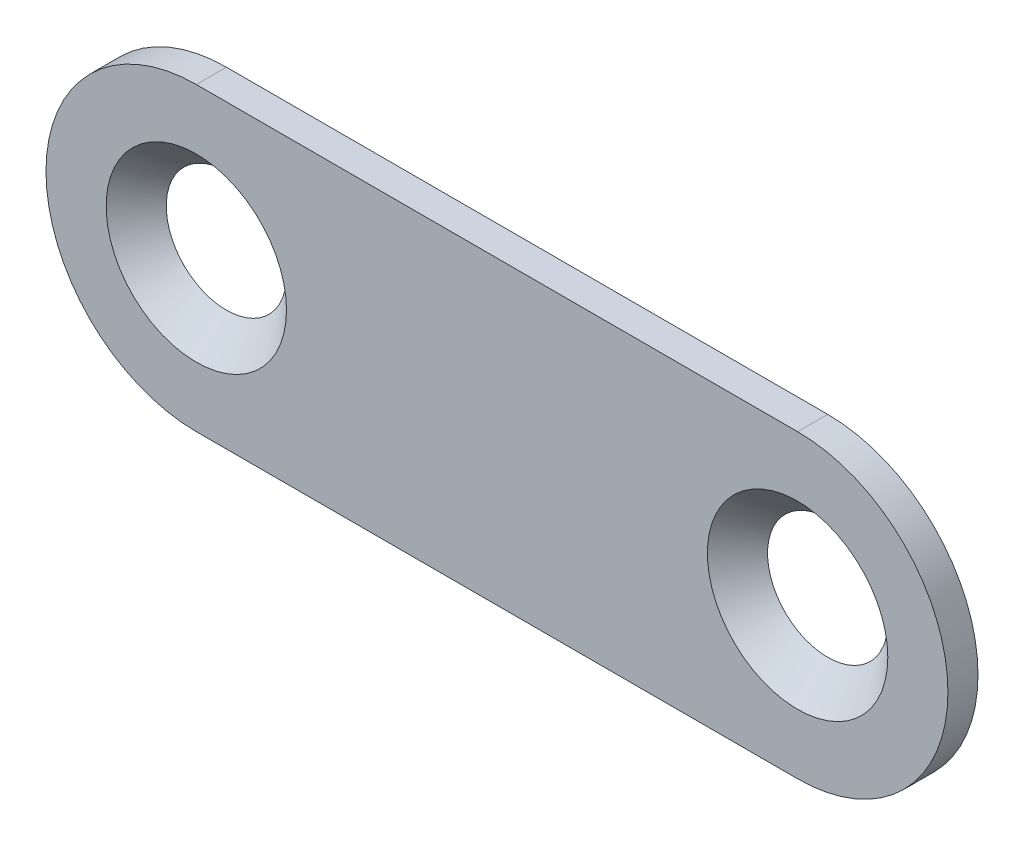
ISO-10303-21;
HEADER;
FILE_DESCRIPTION(('STEP AP214'),'2;1');
FILE_NAME('part.step','',(''),(''),'','','');
FILE_SCHEMA(('AUTOMOTIVE_DESIGN { 1 0 10303 214 1 1 1 1 }'));
ENDSEC;
DATA;
#1=APPLICATION_CONTEXT('core data for automotive mechanical design processes');
#2=APPLICATION_PROTOCOL_DEFINITION('international standard','automotive_design',2000,#1);
#3=PRODUCT_CONTEXT('',#1,'mechanical');
#4=PRODUCT('Part','Part','',(#3));
#5=PRODUCT_RELATED_PRODUCT_CATEGORY('part','',(#4));
#6=PRODUCT_DEFINITION_FORMATION('','',#4);
#7=PRODUCT_DEFINITION_CONTEXT('part definition',#1,'design');
#8=PRODUCT_DEFINITION('design','',#6,#7);
#9=PRODUCT_DEFINITION_SHAPE('','',#8);
#10=(LENGTH_UNIT() NAMED_UNIT(*) SI_UNIT(.MILLI.,.METRE.));
#11=(NAMED_UNIT(*) PLANE_ANGLE_UNIT() SI_UNIT($,.RADIAN.));
#12=(NAMED_UNIT(*) SI_UNIT($,.STERADIAN.) SOLID_ANGLE_UNIT());
#13=UNCERTAINTY_MEASURE_WITH_UNIT(LENGTH_MEASURE(1.E-05),#10,'distance_accuracy_value','');
#14=(GEOMETRIC_REPRESENTATION_CONTEXT(3) GLOBAL_UNCERTAINTY_ASSIGNED_CONTEXT((#13)) GLOBAL_UNIT_ASSIGNED_CONTEXT((#10,
#11,#12)) REPRESENTATION_CONTEXT('',''));
#15=CARTESIAN_POINT('',(0.,0.,0.));
#16=DIRECTION('',(0.,0.,1.));
#17=DIRECTION('',(1.,0.,0.));
#18=AXIS2_PLACEMENT_3D('',#15,#16,#17);
#19=CARTESIAN_POINT('',(20.,-5.,1.));
#20=DIRECTION('',(0.,0.,-1.));
#21=DIRECTION('',(-1.,0.,0.));
#22=AXIS2_PLACEMENT_3D('',#19,#20,#21);
#23=CYLINDRICAL_SURFACE('',#22,5.00000000000001);
#24=CARTESIAN_POINT('',(20.,-5.,0.));
#25=DIRECTION('',(0.,0.,1.));
#26=DIRECTION('',(1.,0.,0.));
#27=AXIS2_PLACEMENT_3D('',#24,#25,#26);
#28=CIRCLE('',#27,5.00000000000001);
#29=CARTESIAN_POINT('',(20.,0.,0.));
#30=VERTEX_POINT('',#29);
#31=CARTESIAN_POINT('',(20.,-10.,0.));
#32=VERTEX_POINT('',#31);
#33=EDGE_CURVE('E111',#30,#32,#28,.F.);
#34=ORIENTED_EDGE('',*,*,#33,.F.);
#35=DIRECTION('',(0.,0.,-1.));
#36=VECTOR('',#35,1.);
#37=CARTESIAN_POINT('',(20.,0.,1.));
#38=LINE('',#37,#36);
#39=CARTESIAN_POINT('',(20.,0.,1.));
#40=VERTEX_POINT('',#39);
#41=EDGE_CURVE('E79',#40,#30,#38,.T.);
#42=ORIENTED_EDGE('',*,*,#41,.F.);
#43=CARTESIAN_POINT('',(20.,-5.,1.));
#44=DIRECTION('',(0.,0.,1.));
#45=DIRECTION('',(1.,0.,0.));
#46=AXIS2_PLACEMENT_3D('',#43,#44,#45);
#47=CIRCLE('',#46,5.00000000000001);
#48=CARTESIAN_POINT('',(20.,-10.,1.));
#49=VERTEX_POINT('',#48);
#50=EDGE_CURVE('E100',#40,#49,#47,.F.);
#51=ORIENTED_EDGE('',*,*,#50,.T.);
#52=DIRECTION('',(0.,0.,-1.));
#53=VECTOR('',#52,1.);
#54=CARTESIAN_POINT('',(20.,-10.,1.));
#55=LINE('',#54,#53);
#56=EDGE_CURVE('E76',#49,#32,#55,.T.);
#57=ORIENTED_EDGE('',*,*,#56,.T.);
#58=EDGE_LOOP('',(#34,#42,#51,#57));
#59=FACE_BOUND('',#58,.T.);
#60=ADVANCED_FACE('F35',(#59),#23,.T.);
#61=CARTESIAN_POINT('',(0.,0.,1.));
#62=DIRECTION('',(0.,1.,0.));
#63=DIRECTION('',(-1.,0.,0.));
#64=AXIS2_PLACEMENT_3D('',#61,#62,#63);
#65=PLANE('',#64);
#66=DIRECTION('',(1.,0.,0.));
#67=VECTOR('',#66,1.);
#68=CARTESIAN_POINT('',(0.,0.,0.));
#69=LINE('',#68,#67);
#70=CARTESIAN_POINT('',(0.,0.,0.));
#71=VERTEX_POINT('',#70);
#72=EDGE_CURVE('E90',#71,#30,#69,.T.);
#73=ORIENTED_EDGE('',*,*,#72,.F.);
#74=DIRECTION('',(0.,0.,-1.));
#75=VECTOR('',#74,1.);
#76=CARTESIAN_POINT('',(0.,0.,1.));
#77=LINE('',#76,#75);
#78=CARTESIAN_POINT('',(0.,0.,1.));
#79=VERTEX_POINT('',#78);
#80=EDGE_CURVE('E84',#79,#71,#77,.T.);
#81=ORIENTED_EDGE('',*,*,#80,.F.);
#82=DIRECTION('',(1.,0.,0.));
#83=VECTOR('',#82,1.);
#84=CARTESIAN_POINT('',(0.,0.,1.));
#85=LINE('',#84,#83);
#86=EDGE_CURVE('E88',#79,#40,#85,.T.);
#87=ORIENTED_EDGE('',*,*,#86,.T.);
#88=ORIENTED_EDGE('',*,*,#41,.T.);
#89=EDGE_LOOP('',(#73,#81,#87,#88));
#90=FACE_BOUND('',#89,.T.);
#91=ADVANCED_FACE('F86',(#90),#65,.T.);
#92=CARTESIAN_POINT('',(0.,-4.99999999999999,1.));
#93=DIRECTION('',(0.,0.,-1.));
#94=DIRECTION('',(-1.,0.,0.));
#95=AXIS2_PLACEMENT_3D('',#92,#93,#94);
#96=CYLINDRICAL_SURFACE('',#95,5.);
#97=CARTESIAN_POINT('',(0.,-4.99999999999999,0.));
#98=DIRECTION('',(0.,0.,1.));
#99=DIRECTION('',(1.,0.,0.));
#100=AXIS2_PLACEMENT_3D('',#97,#98,#99);
#101=CIRCLE('',#100,5.);
#102=CARTESIAN_POINT('',(0.,-10.,0.));
#103=VERTEX_POINT('',#102);
#104=EDGE_CURVE('E114',#71,#103,#101,.T.);
#105=ORIENTED_EDGE('',*,*,#104,.T.);
#106=DIRECTION('',(0.,0.,-1.));
#107=VECTOR('',#106,1.);
#108=CARTESIAN_POINT('',(0.,-10.,1.));
#109=LINE('',#108,#107);
#110=CARTESIAN_POINT('',(0.,-10.,1.));
#111=VERTEX_POINT('',#110);
#112=EDGE_CURVE('E93',#111,#103,#109,.T.);
#113=ORIENTED_EDGE('',*,*,#112,.F.);
#114=CARTESIAN_POINT('',(0.,-4.99999999999999,1.));
#115=DIRECTION('',(0.,0.,1.));
#116=DIRECTION('',(1.,0.,0.));
#117=AXIS2_PLACEMENT_3D('',#114,#115,#116);
#118=CIRCLE('',#117,5.);
#119=EDGE_CURVE('E96',#79,#111,#118,.T.);
#120=ORIENTED_EDGE('',*,*,#119,.F.);
#121=ORIENTED_EDGE('',*,*,#80,.T.);
#122=EDGE_LOOP('',(#105,#113,#120,#121));
#123=FACE_BOUND('',#122,.T.);
#124=ADVANCED_FACE('F97',(#123),#96,.T.);
#125=CARTESIAN_POINT('',(0.,-10.,1.));
#126=DIRECTION('',(0.,1.,0.));
#127=DIRECTION('',(-1.,0.,0.));
#128=AXIS2_PLACEMENT_3D('',#125,#126,#127);
#129=PLANE('',#128);
#130=DIRECTION('',(1.,0.,0.));
#131=VECTOR('',#130,1.);
#132=CARTESIAN_POINT('',(0.,-10.,0.));
#133=LINE('',#132,#131);
#134=EDGE_CURVE('E69',#103,#32,#133,.T.);
#135=ORIENTED_EDGE('',*,*,#134,.T.);
#136=ORIENTED_EDGE('',*,*,#56,.F.);
#137=DIRECTION('',(1.,0.,0.));
#138=VECTOR('',#137,1.);
#139=CARTESIAN_POINT('',(0.,-10.,1.));
#140=LINE('',#139,#138);
#141=EDGE_CURVE('E52',#111,#49,#140,.T.);
#142=ORIENTED_EDGE('',*,*,#141,.F.);
#143=ORIENTED_EDGE('',*,*,#112,.T.);
#144=EDGE_LOOP('',(#135,#136,#142,#143));
#145=FACE_BOUND('',#144,.T.);
#146=ADVANCED_FACE('F148',(#145),#129,.F.);
#147=CARTESIAN_POINT('',(0.,0.,1.));
#148=DIRECTION('',(0.,0.,1.));
#149=DIRECTION('',(1.,0.,0.));
#150=AXIS2_PLACEMENT_3D('',#147,#148,#149);
#151=PLANE('',#150);
#152=CARTESIAN_POINT('',(20.,-4.99999999999999,1.));
#153=DIRECTION('',(0.,0.,1.));
#154=DIRECTION('',(1.,0.,0.));
#155=AXIS2_PLACEMENT_3D('',#152,#153,#154);
#156=CIRCLE('',#155,3.00000000000001);
#157=CARTESIAN_POINT('',(23.,-4.99999999999999,1.));
#158=VERTEX_POINT('',#157);
#159=EDGE_CURVE('E11',#158,#158,#156,.F.);
#160=ORIENTED_EDGE('',*,*,#159,.T.);
#161=EDGE_LOOP('',(#160));
#162=FACE_BOUND('',#161,.T.);
#163=CARTESIAN_POINT('',(0.,-5.,1.));
#164=DIRECTION('',(0.,0.,1.));
#165=DIRECTION('',(1.,0.,0.));
#166=AXIS2_PLACEMENT_3D('',#163,#164,#165);
#167=CIRCLE('',#166,3.00000000000001);
#168=CARTESIAN_POINT('',(3.00000000000001,-5.,1.));
#169=VERTEX_POINT('',#168);
#170=EDGE_CURVE('E44',#169,#169,#167,.F.);
#171=ORIENTED_EDGE('',*,*,#170,.T.);
#172=EDGE_LOOP('',(#171));
#173=FACE_BOUND('',#172,.T.);
#174=ORIENTED_EDGE('',*,*,#50,.F.);
#175=ORIENTED_EDGE('',*,*,#86,.F.);
#176=ORIENTED_EDGE('',*,*,#119,.T.);
#177=ORIENTED_EDGE('',*,*,#141,.T.);
#178=EDGE_LOOP('',(#174,#175,#176,#177));
#179=FACE_BOUND('',#178,.T.);
#180=ADVANCED_FACE('F99',(#162,#173,#179),#151,.T.);
#181=CARTESIAN_POINT('',(0.,0.,0.));
#182=DIRECTION('',(0.,0.,1.));
#183=DIRECTION('',(1.,0.,0.));
#184=AXIS2_PLACEMENT_3D('',#181,#182,#183);
#185=PLANE('',#184);
#186=CARTESIAN_POINT('',(20.,-4.99999999999999,0.));
#187=DIRECTION('',(0.,0.,1.));
#188=DIRECTION('',(1.,0.,0.));
#189=AXIS2_PLACEMENT_3D('',#186,#187,#188);
#190=CIRCLE('',#189,2.);
#191=CARTESIAN_POINT('',(22.,-4.99999999999999,0.));
#192=VERTEX_POINT('',#191);
#193=EDGE_CURVE('E105',#192,#192,#190,.T.);
#194=ORIENTED_EDGE('',*,*,#193,.T.);
#195=EDGE_LOOP('',(#194));
#196=FACE_BOUND('',#195,.T.);
#197=CARTESIAN_POINT('',(0.,-5.,0.));
#198=DIRECTION('',(0.,0.,1.));
#199=DIRECTION('',(1.,0.,0.));
#200=AXIS2_PLACEMENT_3D('',#197,#198,#199);
#201=CIRCLE('',#200,2.);
#202=CARTESIAN_POINT('',(2.,-5.,0.));
#203=VERTEX_POINT('',#202);
#204=EDGE_CURVE('E108',#203,#203,#201,.T.);
#205=ORIENTED_EDGE('',*,*,#204,.T.);
#206=EDGE_LOOP('',(#205));
#207=FACE_BOUND('',#206,.T.);
#208=ORIENTED_EDGE('',*,*,#33,.T.);
#209=ORIENTED_EDGE('',*,*,#134,.F.);
#210=ORIENTED_EDGE('',*,*,#104,.F.);
#211=ORIENTED_EDGE('',*,*,#72,.T.);
#212=EDGE_LOOP('',(#208,#209,#210,#211));
#213=FACE_BOUND('',#212,.T.);
#214=ADVANCED_FACE('F128',(#196,#207,#213),#185,.F.);
#215=CARTESIAN_POINT('',(20.,-4.99999999999999,0.));
#216=DIRECTION('',(0.,0.,1.));
#217=DIRECTION('',(1.,0.,0.));
#218=AXIS2_PLACEMENT_3D('',#215,#216,#217);
#219=CONICAL_SURFACE('',#218,2.,0.78539816339745);
#220=ORIENTED_EDGE('',*,*,#159,.F.);
#221=EDGE_LOOP('',(#220));
#222=FACE_BOUND('',#221,.T.);
#223=ORIENTED_EDGE('',*,*,#193,.F.);
#224=EDGE_LOOP('',(#223));
#225=FACE_BOUND('',#224,.T.);
#226=ADVANCED_FACE('F125',(#222,#225),#219,.F.);
#227=CARTESIAN_POINT('',(0.,-5.,0.));
#228=DIRECTION('',(0.,0.,1.));
#229=DIRECTION('',(1.,0.,0.));
#230=AXIS2_PLACEMENT_3D('',#227,#228,#229);
#231=CONICAL_SURFACE('',#230,2.,0.78539816339745);
#232=ORIENTED_EDGE('',*,*,#170,.F.);
#233=EDGE_LOOP('',(#232));
#234=FACE_BOUND('',#233,.T.);
#235=ORIENTED_EDGE('',*,*,#204,.F.);
#236=EDGE_LOOP('',(#235));
#237=FACE_BOUND('',#236,.T.);
#238=ADVANCED_FACE('F37',(#234,#237),#231,.F.);
#239=CLOSED_SHELL('',(#60,#91,#124,#146,#180,#214,#226,#238));
#240=MANIFOLD_SOLID_BREP('B2',#239);
#241=ADVANCED_BREP_SHAPE_REPRESENTATION('',(#18,#240),#14);
#242=SHAPE_DEFINITION_REPRESENTATION(#9,#241);
ENDSEC;
END-ISO-10303-21;
